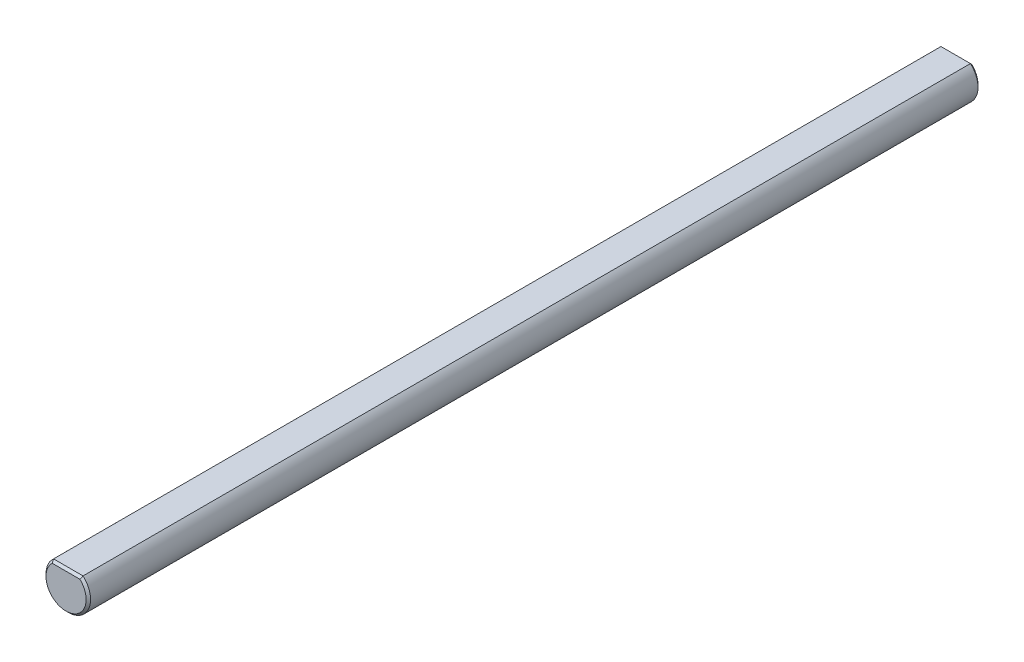
ISO-10303-21;
HEADER;
FILE_DESCRIPTION(('STEP AP214'),'2;1');
FILE_NAME('part.step','',(''),(''),'','','');
FILE_SCHEMA(('AUTOMOTIVE_DESIGN { 1 0 10303 214 1 1 1 1 }'));
ENDSEC;
DATA;
#1=APPLICATION_CONTEXT('core data for automotive mechanical design processes');
#2=APPLICATION_PROTOCOL_DEFINITION('international standard','automotive_design',2000,#1);
#3=PRODUCT_CONTEXT('',#1,'mechanical');
#4=PRODUCT('Part','Part','',(#3));
#5=PRODUCT_RELATED_PRODUCT_CATEGORY('part','',(#4));
#6=PRODUCT_DEFINITION_FORMATION('','',#4);
#7=PRODUCT_DEFINITION_CONTEXT('part definition',#1,'design');
#8=PRODUCT_DEFINITION('design','',#6,#7);
#9=PRODUCT_DEFINITION_SHAPE('','',#8);
#10=(LENGTH_UNIT() NAMED_UNIT(*) SI_UNIT(.MILLI.,.METRE.));
#11=(NAMED_UNIT(*) PLANE_ANGLE_UNIT() SI_UNIT($,.RADIAN.));
#12=(NAMED_UNIT(*) SI_UNIT($,.STERADIAN.) SOLID_ANGLE_UNIT());
#13=UNCERTAINTY_MEASURE_WITH_UNIT(LENGTH_MEASURE(1.E-05),#10,'distance_accuracy_value','');
#14=(GEOMETRIC_REPRESENTATION_CONTEXT(3) GLOBAL_UNCERTAINTY_ASSIGNED_CONTEXT((#13)) GLOBAL_UNIT_ASSIGNED_CONTEXT((#10,
#11,#12)) REPRESENTATION_CONTEXT('',''));
#15=CARTESIAN_POINT('',(0.,0.,0.));
#16=DIRECTION('',(0.,0.,1.));
#17=DIRECTION('',(1.,0.,0.));
#18=AXIS2_PLACEMENT_3D('',#15,#16,#17);
#19=CARTESIAN_POINT('',(0.,1.5,79.8));
#20=DIRECTION('',(0.,-0.707106781186535,-0.70710678118656));
#21=DIRECTION('',(0.,0.70710678118656,-0.707106781186535));
#22=AXIS2_PLACEMENT_3D('',#19,#20,#21);
#23=PLANE('',#22);
#24=CARTESIAN_POINT('',(-1.24498995985318,1.29999999997748,80.0000000000225));
#25=CARTESIAN_POINT('',(-1.25833682025453,1.33326211365244,79.9667378863476));
#26=CARTESIAN_POINT('',(-1.27150073010307,1.3665598504047,79.9334401495953));
#27=CARTESIAN_POINT('',(-1.29746262810521,1.43322651719328,79.8667734828067));
#28=CARTESIAN_POINT('',(-1.31026061683918,1.46659544711659,79.8334045528834));
#29=CARTESIAN_POINT('',(-1.32287565560069,1.5000000000042,79.7999999999958));
#30=B_SPLINE_CURVE_WITH_KNOTS('',3,(#24,#25,#26,#27,#28,#29),.UNSPECIFIED.,.F.,.F.,(4,2,4),(0.,
0.146686412504065,0.293372592346615),.UNSPECIFIED.);
#31=CARTESIAN_POINT('',(-1.24498995983265,1.30000000000002,80.0000000000205));
#32=VERTEX_POINT('',#31);
#33=CARTESIAN_POINT('',(-1.32287565556782,1.5,79.7999999999984));
#34=VERTEX_POINT('',#33);
#35=EDGE_CURVE('E59',#32,#34,#30,.T.);
#36=ORIENTED_EDGE('',*,*,#35,.F.);
#37=DIRECTION('',(1.,0.,0.));
#38=VECTOR('',#37,1.);
#39=CARTESIAN_POINT('',(0.,1.30000000000002,80.));
#40=LINE('',#39,#38);
#41=CARTESIAN_POINT('',(1.24498995982812,1.29999999998875,80.0000000000317));
#42=VERTEX_POINT('',#41);
#43=EDGE_CURVE('E71',#42,#32,#40,.F.);
#44=ORIENTED_EDGE('',*,*,#43,.F.);
#45=CARTESIAN_POINT('',(1.32287565560106,1.50000000000669,79.7999999999933));
#46=CARTESIAN_POINT('',(1.3102606168396,1.46659544711864,79.8334045528814));
#47=CARTESIAN_POINT('',(1.29746262810567,1.4332265171949,79.8667734828051));
#48=CARTESIAN_POINT('',(1.27150073010354,1.36655985040546,79.9334401495946));
#49=CARTESIAN_POINT('',(1.25833682025499,1.33326211365278,79.9667378863472));
#50=CARTESIAN_POINT('',(1.2449899598536,1.2999999999774,80.0000000000226));
#51=B_SPLINE_CURVE_WITH_KNOTS('',3,(#45,#46,#47,#48,#49,#50),.UNSPECIFIED.,.F.,.F.,(4,2,4),(0.,
0.146686179844289,0.293372592350101),.UNSPECIFIED.);
#52=CARTESIAN_POINT('',(1.32287565555521,1.50000000001346,79.7999999999952));
#53=VERTEX_POINT('',#52);
#54=EDGE_CURVE('E18',#53,#42,#51,.T.);
#55=ORIENTED_EDGE('',*,*,#54,.F.);
#56=DIRECTION('',(1.,0.,0.));
#57=VECTOR('',#56,1.);
#58=CARTESIAN_POINT('',(0.,1.5,79.7999999999968));
#59=LINE('',#58,#57);
#60=EDGE_CURVE('E69',#34,#53,#59,.T.);
#61=ORIENTED_EDGE('',*,*,#60,.F.);
#62=EDGE_LOOP('',(#36,#44,#55,#61));
#63=FACE_BOUND('',#62,.T.);
#64=ADVANCED_FACE('F14',(#63),#23,.F.);
#65=CARTESIAN_POINT('',(0.,1.3,0.));
#66=DIRECTION('',(0.,0.707106781186535,-0.70710678118656));
#67=DIRECTION('',(0.,0.70710678118656,0.707106781186535));
#68=AXIS2_PLACEMENT_3D('',#65,#66,#67);
#69=PLANE('',#68);
#70=CARTESIAN_POINT('',(1.24498995973509,1.30000000003534,3.53415914466559E-11));
#71=CARTESIAN_POINT('',(1.25833682013169,1.33326211370179,0.0332621137017913));
#72=CARTESIAN_POINT('',(1.27150072997558,1.36655985044552,0.0665598504455175));
#73=CARTESIAN_POINT('',(1.29746262796864,1.43322651721699,0.133226517216979));
#74=CARTESIAN_POINT('',(1.31026061669818,1.46659544713172,0.16659544713171));
#75=CARTESIAN_POINT('',(1.32287565545536,1.50000000001072,0.200000000010713));
#76=B_SPLINE_CURVE_WITH_KNOTS('',3,(#70,#71,#72,#73,#74,#75),.UNSPECIFIED.,.F.,.F.,(4,2,4),(0.,
0.146686412465449,0.293372592269371),.UNSPECIFIED.);
#77=CARTESIAN_POINT('',(1.24498995976097,1.30000000002544,4.60925096778139E-11));
#78=VERTEX_POINT('',#77);
#79=CARTESIAN_POINT('',(1.32287565549152,1.5,0.199999999999992));
#80=VERTEX_POINT('',#79);
#81=EDGE_CURVE('E72',#78,#80,#76,.T.);
#82=ORIENTED_EDGE('',*,*,#81,.F.);
#83=DIRECTION('',(1.,0.,0.));
#84=VECTOR('',#83,1.);
#85=CARTESIAN_POINT('',(0.,1.30000000001554,0.));
#86=LINE('',#85,#84);
#87=CARTESIAN_POINT('',(-1.24498995976097,1.30000000002544,4.6092597564821E-11));
#88=VERTEX_POINT('',#87);
#89=EDGE_CURVE('E84',#78,#88,#86,.F.);
#90=ORIENTED_EDGE('',*,*,#89,.T.);
#91=CARTESIAN_POINT('',(-1.32287565545474,1.50000000001058,0.200000000010567));
#92=CARTESIAN_POINT('',(-1.31026061669776,1.46659544713158,0.166595447131569));
#93=CARTESIAN_POINT('',(-1.29746262796842,1.43322651721685,0.133226517216845));
#94=CARTESIAN_POINT('',(-1.2715007299757,1.36655985044541,0.0665598504454062));
#95=CARTESIAN_POINT('',(-1.25833682013197,1.3332621137017,0.0332621137016947));
#96=CARTESIAN_POINT('',(-1.24498995973551,1.30000000003526,3.52627525704197E-11));
#97=B_SPLINE_CURVE_WITH_KNOTS('',3,(#91,#92,#93,#94,#95,#96),.UNSPECIFIED.,.F.,.F.,(4,2,4),(0.,
0.14668617980374,0.293372592269004),.UNSPECIFIED.);
#98=CARTESIAN_POINT('',(-1.32287565550238,1.49999999999747,0.200000000012475));
#99=VERTEX_POINT('',#98);
#100=EDGE_CURVE('E88',#99,#88,#97,.T.);
#101=ORIENTED_EDGE('',*,*,#100,.F.);
#102=DIRECTION('',(1.,0.,0.));
#103=VECTOR('',#102,1.);
#104=CARTESIAN_POINT('',(0.,1.5,0.199999999999992));
#105=LINE('',#104,#103);
#106=EDGE_CURVE('E79',#80,#99,#105,.F.);
#107=ORIENTED_EDGE('',*,*,#106,.F.);
#108=EDGE_LOOP('',(#82,#90,#101,#107));
#109=FACE_BOUND('',#108,.T.);
#110=ADVANCED_FACE('F107',(#109),#69,.T.);
#111=CARTESIAN_POINT('',(0.,0.,80.));
#112=DIRECTION('',(0.,0.,1.));
#113=DIRECTION('',(1.,0.,0.));
#114=AXIS2_PLACEMENT_3D('',#111,#112,#113);
#115=PLANE('',#114);
#116=ORIENTED_EDGE('',*,*,#43,.T.);
#117=CARTESIAN_POINT('',(0.,0.,80.0000000000409));
#118=DIRECTION('',(0.,0.,-1.));
#119=DIRECTION('',(-1.,0.,0.));
#120=AXIS2_PLACEMENT_3D('',#117,#118,#119);
#121=CIRCLE('',#120,1.80000000000291);
#122=EDGE_CURVE('E83',#42,#32,#121,.T.);
#123=ORIENTED_EDGE('',*,*,#122,.F.);
#124=EDGE_LOOP('',(#116,#123));
#125=FACE_BOUND('',#124,.T.);
#126=ADVANCED_FACE('F111',(#125),#115,.T.);
#127=CARTESIAN_POINT('',(0.,1.5,80.));
#128=DIRECTION('',(0.,1.,0.));
#129=DIRECTION('',(0.,0.,1.));
#130=AXIS2_PLACEMENT_3D('',#127,#128,#129);
#131=PLANE('',#130);
#132=DIRECTION('',(0.,0.,-1.));
#133=VECTOR('',#132,1.);
#134=CARTESIAN_POINT('',(1.32287565550936,1.50000000002023,80.));
#135=LINE('',#134,#133);
#136=EDGE_CURVE('E77',#80,#53,#135,.F.);
#137=ORIENTED_EDGE('',*,*,#136,.F.);
#138=ORIENTED_EDGE('',*,*,#106,.T.);
#139=DIRECTION('',(0.,0.,-1.));
#140=VECTOR('',#139,1.);
#141=CARTESIAN_POINT('',(-1.32287565555002,1.49999999998437,80.));
#142=LINE('',#141,#140);
#143=EDGE_CURVE('E78',#34,#99,#142,.T.);
#144=ORIENTED_EDGE('',*,*,#143,.F.);
#145=ORIENTED_EDGE('',*,*,#60,.T.);
#146=EDGE_LOOP('',(#137,#138,#144,#145));
#147=FACE_BOUND('',#146,.T.);
#148=ADVANCED_FACE('F75',(#147),#131,.T.);
#149=CARTESIAN_POINT('',(0.,0.,0.));
#150=DIRECTION('',(0.,0.,1.));
#151=DIRECTION('',(1.,0.,0.));
#152=AXIS2_PLACEMENT_3D('',#149,#150,#151);
#153=PLANE('',#152);
#154=ORIENTED_EDGE('',*,*,#89,.F.);
#155=CARTESIAN_POINT('',(0.,0.,5.6843418860808E-11));
#156=DIRECTION('',(0.,0.,1.));
#157=DIRECTION('',(1.,0.,0.));
#158=AXIS2_PLACEMENT_3D('',#155,#156,#157);
#159=CIRCLE('',#158,1.80000000000291);
#160=EDGE_CURVE('E65',#88,#78,#159,.T.);
#161=ORIENTED_EDGE('',*,*,#160,.F.);
#162=EDGE_LOOP('',(#154,#161));
#163=FACE_BOUND('',#162,.T.);
#164=ADVANCED_FACE('F126',(#163),#153,.F.);
#165=CARTESIAN_POINT('',(0.,0.,79.8000000000911));
#166=DIRECTION('',(0.,0.,-1.));
#167=DIRECTION('',(-1.,0.,0.));
#168=AXIS2_PLACEMENT_3D('',#165,#166,#167);
#169=CONICAL_SURFACE('',#168,1.99999999995271,0.785398163397448);
#170=ORIENTED_EDGE('',*,*,#122,.T.);
#171=ORIENTED_EDGE('',*,*,#35,.T.);
#172=CARTESIAN_POINT('',(0.,0.,79.8));
#173=DIRECTION('',(0.,0.,-1.));
#174=DIRECTION('',(-1.,0.,0.));
#175=AXIS2_PLACEMENT_3D('',#172,#173,#174);
#176=CIRCLE('',#175,2.);
#177=EDGE_CURVE('E28',#53,#34,#176,.T.);
#178=ORIENTED_EDGE('',*,*,#177,.F.);
#179=ORIENTED_EDGE('',*,*,#54,.T.);
#180=EDGE_LOOP('',(#170,#171,#178,#179));
#181=FACE_BOUND('',#180,.T.);
#182=ADVANCED_FACE('F56',(#181),#169,.T.);
#183=CARTESIAN_POINT('',(0.,0.,0.200000000006639));
#184=DIRECTION('',(0.,0.,1.));
#185=DIRECTION('',(1.,0.,0.));
#186=AXIS2_PLACEMENT_3D('',#183,#184,#185);
#187=CONICAL_SURFACE('',#186,1.99999999995271,0.785398163397448);
#188=ORIENTED_EDGE('',*,*,#160,.T.);
#189=ORIENTED_EDGE('',*,*,#81,.T.);
#190=CARTESIAN_POINT('',(0.,0.,0.199999999999992));
#191=DIRECTION('',(0.,0.,-1.));
#192=DIRECTION('',(-1.,0.,0.));
#193=AXIS2_PLACEMENT_3D('',#190,#191,#192);
#194=CIRCLE('',#193,2.);
#195=EDGE_CURVE('E9',#99,#80,#194,.F.);
#196=ORIENTED_EDGE('',*,*,#195,.F.);
#197=ORIENTED_EDGE('',*,*,#100,.T.);
#198=EDGE_LOOP('',(#188,#189,#196,#197));
#199=FACE_BOUND('',#198,.T.);
#200=ADVANCED_FACE('F104',(#199),#187,.T.);
#201=CARTESIAN_POINT('',(0.,0.,80.));
#202=DIRECTION('',(0.,0.,-1.));
#203=DIRECTION('',(-1.,0.,0.));
#204=AXIS2_PLACEMENT_3D('',#201,#202,#203);
#205=CYLINDRICAL_SURFACE('',#204,2.);
#206=ORIENTED_EDGE('',*,*,#177,.T.);
#207=ORIENTED_EDGE('',*,*,#143,.T.);
#208=ORIENTED_EDGE('',*,*,#195,.T.);
#209=ORIENTED_EDGE('',*,*,#136,.T.);
#210=EDGE_LOOP('',(#206,#207,#208,#209));
#211=FACE_BOUND('',#210,.T.);
#212=ADVANCED_FACE('F81',(#211),#205,.T.);
#213=CLOSED_SHELL('',(#64,#110,#126,#148,#164,#182,#200,#212));
#214=MANIFOLD_SOLID_BREP('B1',#213);
#215=ADVANCED_BREP_SHAPE_REPRESENTATION('',(#18,#214),#14);
#216=SHAPE_DEFINITION_REPRESENTATION(#9,#215);
ENDSEC;
END-ISO-10303-21;
